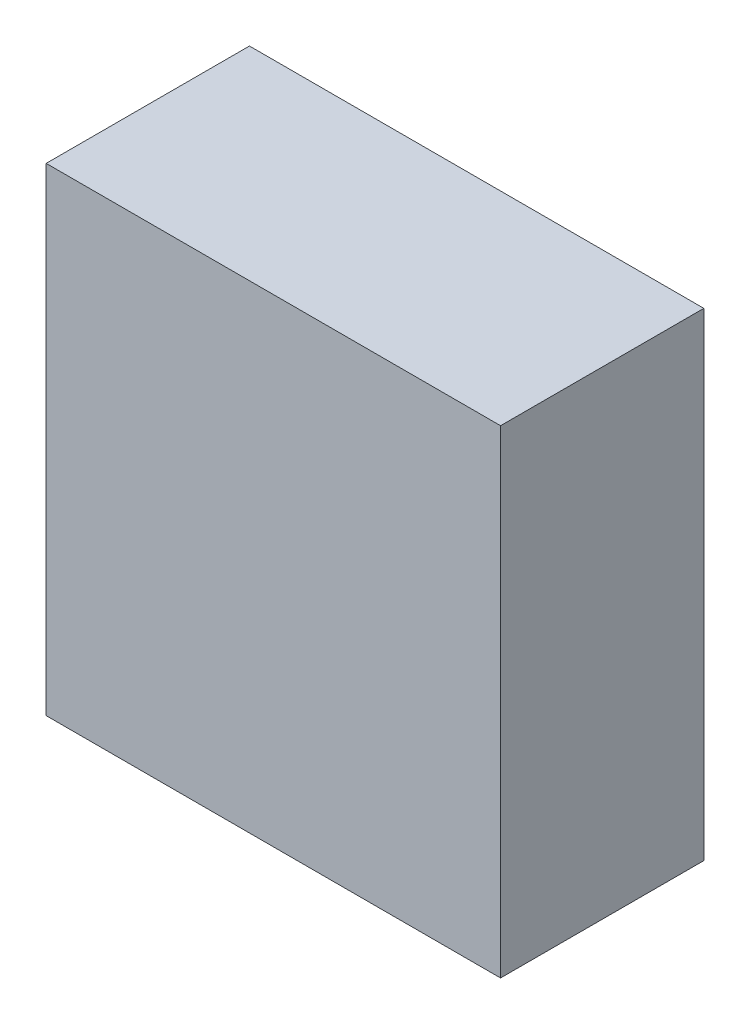
ISO-10303-21;
HEADER;
FILE_DESCRIPTION(('STEP AP214'),'2;1');
FILE_NAME('part.step','',(''),(''),'','','');
FILE_SCHEMA(('AUTOMOTIVE_DESIGN { 1 0 10303 214 1 1 1 1 }'));
ENDSEC;
DATA;
#1=APPLICATION_CONTEXT('core data for automotive mechanical design processes');
#2=APPLICATION_PROTOCOL_DEFINITION('international standard','automotive_design',2000,#1);
#3=PRODUCT_CONTEXT('',#1,'mechanical');
#4=PRODUCT('Part','Part','',(#3));
#5=PRODUCT_RELATED_PRODUCT_CATEGORY('part','',(#4));
#6=PRODUCT_DEFINITION_FORMATION('','',#4);
#7=PRODUCT_DEFINITION_CONTEXT('part definition',#1,'design');
#8=PRODUCT_DEFINITION('design','',#6,#7);
#9=PRODUCT_DEFINITION_SHAPE('','',#8);
#10=(LENGTH_UNIT() NAMED_UNIT(*) SI_UNIT(.MILLI.,.METRE.));
#11=(NAMED_UNIT(*) PLANE_ANGLE_UNIT() SI_UNIT($,.RADIAN.));
#12=(NAMED_UNIT(*) SI_UNIT($,.STERADIAN.) SOLID_ANGLE_UNIT());
#13=UNCERTAINTY_MEASURE_WITH_UNIT(LENGTH_MEASURE(1.E-05),#10,'distance_accuracy_value','');
#14=(GEOMETRIC_REPRESENTATION_CONTEXT(3) GLOBAL_UNCERTAINTY_ASSIGNED_CONTEXT((#13)) GLOBAL_UNIT_ASSIGNED_CONTEXT((#10,
#11,#12)) REPRESENTATION_CONTEXT('',''));
#15=CARTESIAN_POINT('',(0.,0.,0.));
#16=DIRECTION('',(0.,0.,1.));
#17=DIRECTION('',(1.,0.,0.));
#18=AXIS2_PLACEMENT_3D('',#15,#16,#17);
#19=CARTESIAN_POINT('',(14.478,30.48,-6.477));
#20=DIRECTION('',(-1.,0.,0.));
#21=DIRECTION('',(0.,0.,1.));
#22=AXIS2_PLACEMENT_3D('',#19,#20,#21);
#23=PLANE('',#22);
#24=DIRECTION('',(0.,0.,-1.));
#25=VECTOR('',#24,1.);
#26=CARTESIAN_POINT('',(14.478,0.,-6.477));
#27=LINE('',#26,#25);
#28=CARTESIAN_POINT('',(14.478,0.,6.477));
#29=VERTEX_POINT('',#28);
#30=CARTESIAN_POINT('',(14.478,0.,-6.477));
#31=VERTEX_POINT('',#30);
#32=EDGE_CURVE('E95',#29,#31,#27,.T.);
#33=ORIENTED_EDGE('',*,*,#32,.T.);
#34=DIRECTION('',(0.,-1.,0.));
#35=VECTOR('',#34,1.);
#36=CARTESIAN_POINT('',(14.478,30.48,-6.477));
#37=LINE('',#36,#35);
#38=CARTESIAN_POINT('',(14.478,30.48,-6.477));
#39=VERTEX_POINT('',#38);
#40=EDGE_CURVE('E11',#39,#31,#37,.T.);
#41=ORIENTED_EDGE('',*,*,#40,.F.);
#42=DIRECTION('',(0.,0.,-1.));
#43=VECTOR('',#42,1.);
#44=CARTESIAN_POINT('',(14.478,30.48,-6.477));
#45=LINE('',#44,#43);
#46=CARTESIAN_POINT('',(14.478,30.48,6.477));
#47=VERTEX_POINT('',#46);
#48=EDGE_CURVE('E83',#47,#39,#45,.T.);
#49=ORIENTED_EDGE('',*,*,#48,.F.);
#50=DIRECTION('',(0.,-1.,0.));
#51=VECTOR('',#50,1.);
#52=CARTESIAN_POINT('',(14.478,30.48,6.477));
#53=LINE('',#52,#51);
#54=EDGE_CURVE('E91',#47,#29,#53,.T.);
#55=ORIENTED_EDGE('',*,*,#54,.T.);
#56=EDGE_LOOP('',(#33,#41,#49,#55));
#57=FACE_BOUND('',#56,.T.);
#58=ADVANCED_FACE('F32',(#57),#23,.F.);
#59=CARTESIAN_POINT('',(-14.478,30.48,-6.477));
#60=DIRECTION('',(0.,0.,1.));
#61=DIRECTION('',(1.,0.,0.));
#62=AXIS2_PLACEMENT_3D('',#59,#60,#61);
#63=PLANE('',#62);
#64=DIRECTION('',(-1.,0.,0.));
#65=VECTOR('',#64,1.);
#66=CARTESIAN_POINT('',(-14.478,0.,-6.477));
#67=LINE('',#66,#65);
#68=CARTESIAN_POINT('',(-14.478,0.,-6.477));
#69=VERTEX_POINT('',#68);
#70=EDGE_CURVE('E87',#31,#69,#67,.T.);
#71=ORIENTED_EDGE('',*,*,#70,.T.);
#72=DIRECTION('',(0.,-1.,0.));
#73=VECTOR('',#72,1.);
#74=CARTESIAN_POINT('',(-14.478,30.48,-6.477));
#75=LINE('',#74,#73);
#76=CARTESIAN_POINT('',(-14.478,30.48,-6.477));
#77=VERTEX_POINT('',#76);
#78=EDGE_CURVE('E40',#77,#69,#75,.T.);
#79=ORIENTED_EDGE('',*,*,#78,.F.);
#80=DIRECTION('',(-1.,0.,0.));
#81=VECTOR('',#80,1.);
#82=CARTESIAN_POINT('',(-14.478,30.48,-6.477));
#83=LINE('',#82,#81);
#84=EDGE_CURVE('E78',#39,#77,#83,.T.);
#85=ORIENTED_EDGE('',*,*,#84,.F.);
#86=ORIENTED_EDGE('',*,*,#40,.T.);
#87=EDGE_LOOP('',(#71,#79,#85,#86));
#88=FACE_BOUND('',#87,.T.);
#89=ADVANCED_FACE('F86',(#88),#63,.F.);
#90=CARTESIAN_POINT('',(-14.478,30.48,-6.477));
#91=DIRECTION('',(1.,0.,0.));
#92=DIRECTION('',(0.,0.,-1.));
#93=AXIS2_PLACEMENT_3D('',#90,#91,#92);
#94=PLANE('',#93);
#95=DIRECTION('',(0.,0.,1.));
#96=VECTOR('',#95,1.);
#97=CARTESIAN_POINT('',(-14.478,0.,-6.477));
#98=LINE('',#97,#96);
#99=CARTESIAN_POINT('',(-14.478,0.,6.477));
#100=VERTEX_POINT('',#99);
#101=EDGE_CURVE('E65',#69,#100,#98,.T.);
#102=ORIENTED_EDGE('',*,*,#101,.T.);
#103=DIRECTION('',(0.,-1.,0.));
#104=VECTOR('',#103,1.);
#105=CARTESIAN_POINT('',(-14.478,30.48,6.477));
#106=LINE('',#105,#104);
#107=CARTESIAN_POINT('',(-14.478,30.48,6.477));
#108=VERTEX_POINT('',#107);
#109=EDGE_CURVE('E88',#108,#100,#106,.T.);
#110=ORIENTED_EDGE('',*,*,#109,.F.);
#111=DIRECTION('',(0.,0.,1.));
#112=VECTOR('',#111,1.);
#113=CARTESIAN_POINT('',(-14.478,30.48,-6.477));
#114=LINE('',#113,#112);
#115=EDGE_CURVE('E81',#77,#108,#114,.T.);
#116=ORIENTED_EDGE('',*,*,#115,.F.);
#117=ORIENTED_EDGE('',*,*,#78,.T.);
#118=EDGE_LOOP('',(#102,#110,#116,#117));
#119=FACE_BOUND('',#118,.T.);
#120=ADVANCED_FACE('F89',(#119),#94,.F.);
#121=CARTESIAN_POINT('',(-14.478,30.48,6.477));
#122=DIRECTION('',(0.,0.,-1.));
#123=DIRECTION('',(-1.,0.,0.));
#124=AXIS2_PLACEMENT_3D('',#121,#122,#123);
#125=PLANE('',#124);
#126=DIRECTION('',(1.,0.,0.));
#127=VECTOR('',#126,1.);
#128=CARTESIAN_POINT('',(-14.478,0.,6.477));
#129=LINE('',#128,#127);
#130=EDGE_CURVE('E71',#100,#29,#129,.T.);
#131=ORIENTED_EDGE('',*,*,#130,.T.);
#132=ORIENTED_EDGE('',*,*,#54,.F.);
#133=DIRECTION('',(1.,0.,0.));
#134=VECTOR('',#133,1.);
#135=CARTESIAN_POINT('',(-14.478,30.48,6.477));
#136=LINE('',#135,#134);
#137=EDGE_CURVE('E48',#108,#47,#136,.T.);
#138=ORIENTED_EDGE('',*,*,#137,.F.);
#139=ORIENTED_EDGE('',*,*,#109,.T.);
#140=EDGE_LOOP('',(#131,#132,#138,#139));
#141=FACE_BOUND('',#140,.T.);
#142=ADVANCED_FACE('F102',(#141),#125,.F.);
#143=CARTESIAN_POINT('',(0.,30.48,0.));
#144=DIRECTION('',(0.,1.,0.));
#145=DIRECTION('',(0.,0.,1.));
#146=AXIS2_PLACEMENT_3D('',#143,#144,#145);
#147=PLANE('',#146);
#148=ORIENTED_EDGE('',*,*,#48,.T.);
#149=ORIENTED_EDGE('',*,*,#84,.T.);
#150=ORIENTED_EDGE('',*,*,#115,.T.);
#151=ORIENTED_EDGE('',*,*,#137,.T.);
#152=EDGE_LOOP('',(#148,#149,#150,#151));
#153=FACE_BOUND('',#152,.T.);
#154=ADVANCED_FACE('F79',(#153),#147,.T.);
#155=CARTESIAN_POINT('',(0.,0.,0.));
#156=DIRECTION('',(0.,1.,0.));
#157=DIRECTION('',(0.,0.,1.));
#158=AXIS2_PLACEMENT_3D('',#155,#156,#157);
#159=PLANE('',#158);
#160=ORIENTED_EDGE('',*,*,#32,.F.);
#161=ORIENTED_EDGE('',*,*,#130,.F.);
#162=ORIENTED_EDGE('',*,*,#101,.F.);
#163=ORIENTED_EDGE('',*,*,#70,.F.);
#164=EDGE_LOOP('',(#160,#161,#162,#163));
#165=FACE_BOUND('',#164,.T.);
#166=ADVANCED_FACE('F105',(#165),#159,.F.);
#167=CLOSED_SHELL('',(#58,#89,#120,#142,#154,#166));
#168=MANIFOLD_SOLID_BREP('B2',#167);
#169=ADVANCED_BREP_SHAPE_REPRESENTATION('',(#18,#168),#14);
#170=SHAPE_DEFINITION_REPRESENTATION(#9,#169);
ENDSEC;
END-ISO-10303-21;
